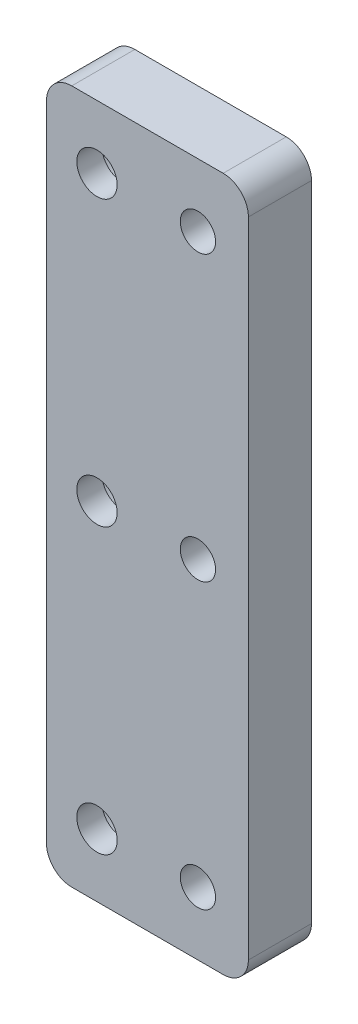
ISO-10303-21;
HEADER;
FILE_DESCRIPTION(('STEP AP214'),'2;1');
FILE_NAME('part.step','',(''),(''),'','','');
FILE_SCHEMA(('AUTOMOTIVE_DESIGN { 1 0 10303 214 1 1 1 1 }'));
ENDSEC;
DATA;
#1=APPLICATION_CONTEXT('core data for automotive mechanical design processes');
#2=APPLICATION_PROTOCOL_DEFINITION('international standard','automotive_design',2000,#1);
#3=PRODUCT_CONTEXT('',#1,'mechanical');
#4=PRODUCT('Part','Part','',(#3));
#5=PRODUCT_RELATED_PRODUCT_CATEGORY('part','',(#4));
#6=PRODUCT_DEFINITION_FORMATION('','',#4);
#7=PRODUCT_DEFINITION_CONTEXT('part definition',#1,'design');
#8=PRODUCT_DEFINITION('design','',#6,#7);
#9=PRODUCT_DEFINITION_SHAPE('','',#8);
#10=(LENGTH_UNIT() NAMED_UNIT(*) SI_UNIT(.MILLI.,.METRE.));
#11=(NAMED_UNIT(*) PLANE_ANGLE_UNIT() SI_UNIT($,.RADIAN.));
#12=(NAMED_UNIT(*) SI_UNIT($,.STERADIAN.) SOLID_ANGLE_UNIT());
#13=UNCERTAINTY_MEASURE_WITH_UNIT(LENGTH_MEASURE(1.E-05),#10,'distance_accuracy_value','');
#14=(GEOMETRIC_REPRESENTATION_CONTEXT(3) GLOBAL_UNCERTAINTY_ASSIGNED_CONTEXT((#13)) GLOBAL_UNIT_ASSIGNED_CONTEXT((#10,
#11,#12)) REPRESENTATION_CONTEXT('',''));
#15=CARTESIAN_POINT('',(0.,0.,0.));
#16=DIRECTION('',(0.,0.,1.));
#17=DIRECTION('',(1.,0.,0.));
#18=AXIS2_PLACEMENT_3D('',#15,#16,#17);
#19=CARTESIAN_POINT('',(-4.,-27.5,-2.5));
#20=DIRECTION('',(0.,-1.,0.));
#21=DIRECTION('',(0.,0.,-1.));
#22=AXIS2_PLACEMENT_3D('',#19,#20,#21);
#23=PLANE('',#22);
#24=DIRECTION('',(1.,0.,0.));
#25=VECTOR('',#24,1.);
#26=CARTESIAN_POINT('',(-4.,-27.5,2.5));
#27=LINE('',#26,#25);
#28=CARTESIAN_POINT('',(-2.,-27.5,2.5));
#29=VERTEX_POINT('',#28);
#30=CARTESIAN_POINT('',(10.,-27.5,2.5));
#31=VERTEX_POINT('',#30);
#32=EDGE_CURVE('E125',#29,#31,#27,.T.);
#33=ORIENTED_EDGE('',*,*,#32,.F.);
#34=DIRECTION('',(0.,0.,1.));
#35=VECTOR('',#34,1.);
#36=CARTESIAN_POINT('',(-2.,-27.5,-2.5));
#37=LINE('',#36,#35);
#38=CARTESIAN_POINT('',(-2.,-27.5,-2.5));
#39=VERTEX_POINT('',#38);
#40=EDGE_CURVE('E145',#29,#39,#37,.F.);
#41=ORIENTED_EDGE('',*,*,#40,.T.);
#42=DIRECTION('',(1.,0.,0.));
#43=VECTOR('',#42,1.);
#44=CARTESIAN_POINT('',(-4.,-27.5,-2.5));
#45=LINE('',#44,#43);
#46=CARTESIAN_POINT('',(10.,-27.5,-2.5));
#47=VERTEX_POINT('',#46);
#48=EDGE_CURVE('E130',#39,#47,#45,.T.);
#49=ORIENTED_EDGE('',*,*,#48,.T.);
#50=DIRECTION('',(0.,0.,1.));
#51=VECTOR('',#50,1.);
#52=CARTESIAN_POINT('',(10.,-27.5,-2.5));
#53=LINE('',#52,#51);
#54=EDGE_CURVE('E142',#47,#31,#53,.T.);
#55=ORIENTED_EDGE('',*,*,#54,.T.);
#56=EDGE_LOOP('',(#33,#41,#49,#55));
#57=FACE_BOUND('',#56,.T.);
#58=ADVANCED_FACE('F37',(#57),#23,.T.);
#59=CARTESIAN_POINT('',(-4.,-27.5,-2.5));
#60=DIRECTION('',(-1.,0.,0.));
#61=DIRECTION('',(0.,0.,1.));
#62=AXIS2_PLACEMENT_3D('',#59,#60,#61);
#63=PLANE('',#62);
#64=DIRECTION('',(0.,-1.,0.));
#65=VECTOR('',#64,1.);
#66=CARTESIAN_POINT('',(-4.,-27.5,-2.5));
#67=LINE('',#66,#65);
#68=CARTESIAN_POINT('',(-4.,25.5,-2.5));
#69=VERTEX_POINT('',#68);
#70=CARTESIAN_POINT('',(-4.,-25.5,-2.5));
#71=VERTEX_POINT('',#70);
#72=EDGE_CURVE('E134',#69,#71,#67,.T.);
#73=ORIENTED_EDGE('',*,*,#72,.T.);
#74=DIRECTION('',(0.,0.,1.));
#75=VECTOR('',#74,1.);
#76=CARTESIAN_POINT('',(-4.,-25.5,-2.5));
#77=LINE('',#76,#75);
#78=CARTESIAN_POINT('',(-4.,-25.5,2.5));
#79=VERTEX_POINT('',#78);
#80=EDGE_CURVE('E124',#71,#79,#77,.T.);
#81=ORIENTED_EDGE('',*,*,#80,.T.);
#82=DIRECTION('',(0.,-1.,0.));
#83=VECTOR('',#82,1.);
#84=CARTESIAN_POINT('',(-4.,-27.5,2.5));
#85=LINE('',#84,#83);
#86=CARTESIAN_POINT('',(-4.,25.5,2.5));
#87=VERTEX_POINT('',#86);
#88=EDGE_CURVE('E108',#87,#79,#85,.T.);
#89=ORIENTED_EDGE('',*,*,#88,.F.);
#90=DIRECTION('',(0.,0.,1.));
#91=VECTOR('',#90,1.);
#92=CARTESIAN_POINT('',(-4.,25.5,-2.5));
#93=LINE('',#92,#91);
#94=EDGE_CURVE('E121',#87,#69,#93,.F.);
#95=ORIENTED_EDGE('',*,*,#94,.T.);
#96=EDGE_LOOP('',(#73,#81,#89,#95));
#97=FACE_BOUND('',#96,.T.);
#98=ADVANCED_FACE('F120',(#97),#63,.T.);
#99=CARTESIAN_POINT('',(-4.,27.5,-2.5));
#100=DIRECTION('',(0.,1.,0.));
#101=DIRECTION('',(0.,0.,1.));
#102=AXIS2_PLACEMENT_3D('',#99,#100,#101);
#103=PLANE('',#102);
#104=DIRECTION('',(-1.,0.,0.));
#105=VECTOR('',#104,1.);
#106=CARTESIAN_POINT('',(-4.,27.5,-2.5));
#107=LINE('',#106,#105);
#108=CARTESIAN_POINT('',(10.,27.5,-2.5));
#109=VERTEX_POINT('',#108);
#110=CARTESIAN_POINT('',(-2.,27.5,-2.5));
#111=VERTEX_POINT('',#110);
#112=EDGE_CURVE('E160',#109,#111,#107,.T.);
#113=ORIENTED_EDGE('',*,*,#112,.T.);
#114=DIRECTION('',(0.,0.,1.));
#115=VECTOR('',#114,1.);
#116=CARTESIAN_POINT('',(-2.,27.5,-2.5));
#117=LINE('',#116,#115);
#118=CARTESIAN_POINT('',(-2.,27.5,2.5));
#119=VERTEX_POINT('',#118);
#120=EDGE_CURVE('E11',#111,#119,#117,.T.);
#121=ORIENTED_EDGE('',*,*,#120,.T.);
#122=DIRECTION('',(-1.,0.,0.));
#123=VECTOR('',#122,1.);
#124=CARTESIAN_POINT('',(-4.,27.5,2.5));
#125=LINE('',#124,#123);
#126=CARTESIAN_POINT('',(10.,27.5,2.5));
#127=VERTEX_POINT('',#126);
#128=EDGE_CURVE('E110',#127,#119,#125,.T.);
#129=ORIENTED_EDGE('',*,*,#128,.F.);
#130=DIRECTION('',(0.,0.,1.));
#131=VECTOR('',#130,1.);
#132=CARTESIAN_POINT('',(10.,27.5,-2.5));
#133=LINE('',#132,#131);
#134=EDGE_CURVE('E45',#127,#109,#133,.F.);
#135=ORIENTED_EDGE('',*,*,#134,.T.);
#136=EDGE_LOOP('',(#113,#121,#129,#135));
#137=FACE_BOUND('',#136,.T.);
#138=ADVANCED_FACE('F159',(#137),#103,.T.);
#139=CARTESIAN_POINT('',(0.,0.,-2.5));
#140=DIRECTION('',(0.,0.,-1.));
#141=DIRECTION('',(-1.,0.,0.));
#142=AXIS2_PLACEMENT_3D('',#139,#140,#141);
#143=PLANE('',#142);
#144=CARTESIAN_POINT('',(0.,22.5,-2.5));
#145=DIRECTION('',(0.,0.,-1.));
#146=DIRECTION('',(-1.,0.,0.));
#147=AXIS2_PLACEMENT_3D('',#144,#145,#146);
#148=CIRCLE('',#147,3.5);
#149=CARTESIAN_POINT('',(-3.5,22.5,-2.5));
#150=VERTEX_POINT('',#149);
#151=EDGE_CURVE('E230',#150,#150,#148,.T.);
#152=ORIENTED_EDGE('',*,*,#151,.F.);
#153=EDGE_LOOP('',(#152));
#154=FACE_BOUND('',#153,.T.);
#155=CARTESIAN_POINT('',(0.,-22.5,-2.5));
#156=DIRECTION('',(0.,0.,-1.));
#157=DIRECTION('',(-1.,0.,0.));
#158=AXIS2_PLACEMENT_3D('',#155,#156,#157);
#159=CIRCLE('',#158,3.5);
#160=CARTESIAN_POINT('',(-3.5,-22.5,-2.5));
#161=VERTEX_POINT('',#160);
#162=EDGE_CURVE('E234',#161,#161,#159,.T.);
#163=ORIENTED_EDGE('',*,*,#162,.F.);
#164=EDGE_LOOP('',(#163));
#165=FACE_BOUND('',#164,.T.);
#166=CARTESIAN_POINT('',(0.,0.,-2.5));
#167=DIRECTION('',(0.,0.,-1.));
#168=DIRECTION('',(-1.,0.,0.));
#169=AXIS2_PLACEMENT_3D('',#166,#167,#168);
#170=CIRCLE('',#169,3.5);
#171=CARTESIAN_POINT('',(-3.5,0.,-2.5));
#172=VERTEX_POINT('',#171);
#173=EDGE_CURVE('E237',#172,#172,#170,.T.);
#174=ORIENTED_EDGE('',*,*,#173,.F.);
#175=EDGE_LOOP('',(#174));
#176=FACE_BOUND('',#175,.T.);
#177=ORIENTED_EDGE('',*,*,#48,.F.);
#178=CARTESIAN_POINT('',(-2.,-25.5,-2.5));
#179=DIRECTION('',(0.,0.,-1.));
#180=DIRECTION('',(-1.,0.,0.));
#181=AXIS2_PLACEMENT_3D('',#178,#179,#180);
#182=CIRCLE('',#181,2.);
#183=EDGE_CURVE('E151',#39,#71,#182,.T.);
#184=ORIENTED_EDGE('',*,*,#183,.T.);
#185=ORIENTED_EDGE('',*,*,#72,.F.);
#186=CARTESIAN_POINT('',(-2.,25.5,-2.5));
#187=DIRECTION('',(0.,0.,-1.));
#188=DIRECTION('',(-1.,0.,0.));
#189=AXIS2_PLACEMENT_3D('',#186,#187,#188);
#190=CIRCLE('',#189,2.);
#191=EDGE_CURVE('E129',#69,#111,#190,.T.);
#192=ORIENTED_EDGE('',*,*,#191,.T.);
#193=ORIENTED_EDGE('',*,*,#112,.F.);
#194=CARTESIAN_POINT('',(10.,25.5,-2.5));
#195=DIRECTION('',(0.,0.,-1.));
#196=DIRECTION('',(-1.,0.,0.));
#197=AXIS2_PLACEMENT_3D('',#194,#195,#196);
#198=CIRCLE('',#197,2.);
#199=CARTESIAN_POINT('',(12.,25.5,-2.5));
#200=VERTEX_POINT('',#199);
#201=EDGE_CURVE('E52',#109,#200,#198,.T.);
#202=ORIENTED_EDGE('',*,*,#201,.T.);
#203=DIRECTION('',(0.,1.,0.));
#204=VECTOR('',#203,1.);
#205=CARTESIAN_POINT('',(12.,27.5,-2.5));
#206=LINE('',#205,#204);
#207=CARTESIAN_POINT('',(12.,-25.5,-2.5));
#208=VERTEX_POINT('',#207);
#209=EDGE_CURVE('E170',#208,#200,#206,.T.);
#210=ORIENTED_EDGE('',*,*,#209,.F.);
#211=CARTESIAN_POINT('',(10.,-25.5,-2.5));
#212=DIRECTION('',(0.,0.,-1.));
#213=DIRECTION('',(-1.,0.,0.));
#214=AXIS2_PLACEMENT_3D('',#211,#212,#213);
#215=CIRCLE('',#214,2.);
#216=EDGE_CURVE('E149',#208,#47,#215,.T.);
#217=ORIENTED_EDGE('',*,*,#216,.T.);
#218=EDGE_LOOP('',(#177,#184,#185,#192,#193,#202,#210,#217));
#219=FACE_BOUND('',#218,.T.);
#220=CARTESIAN_POINT('',(8.00000000000001,-22.5,-2.5));
#221=DIRECTION('',(0.,0.,1.));
#222=DIRECTION('',(1.,0.,0.));
#223=AXIS2_PLACEMENT_3D('',#220,#221,#222);
#224=CIRCLE('',#223,1.4);
#225=CARTESIAN_POINT('',(9.40000000000001,-22.5,-2.5));
#226=VERTEX_POINT('',#225);
#227=EDGE_CURVE('E253',#226,#226,#224,.T.);
#228=ORIENTED_EDGE('',*,*,#227,.T.);
#229=EDGE_LOOP('',(#228));
#230=FACE_BOUND('',#229,.T.);
#231=CARTESIAN_POINT('',(8.,0.,-2.5));
#232=DIRECTION('',(0.,0.,1.));
#233=DIRECTION('',(1.,0.,0.));
#234=AXIS2_PLACEMENT_3D('',#231,#232,#233);
#235=CIRCLE('',#234,1.4);
#236=CARTESIAN_POINT('',(9.4,0.,-2.5));
#237=VERTEX_POINT('',#236);
#238=EDGE_CURVE('E259',#237,#237,#235,.T.);
#239=ORIENTED_EDGE('',*,*,#238,.T.);
#240=EDGE_LOOP('',(#239));
#241=FACE_BOUND('',#240,.T.);
#242=CARTESIAN_POINT('',(8.,22.5,-2.5));
#243=DIRECTION('',(0.,0.,1.));
#244=DIRECTION('',(1.,0.,0.));
#245=AXIS2_PLACEMENT_3D('',#242,#243,#244);
#246=CIRCLE('',#245,1.4);
#247=CARTESIAN_POINT('',(9.4,22.5,-2.5));
#248=VERTEX_POINT('',#247);
#249=EDGE_CURVE('E172',#248,#248,#246,.T.);
#250=ORIENTED_EDGE('',*,*,#249,.T.);
#251=EDGE_LOOP('',(#250));
#252=FACE_BOUND('',#251,.T.);
#253=ADVANCED_FACE('F163',(#154,#165,#176,#219,#230,#241,#252),#143,.T.);
#254=CARTESIAN_POINT('',(0.,0.,2.5));
#255=DIRECTION('',(0.,0.,-1.));
#256=DIRECTION('',(-1.,0.,0.));
#257=AXIS2_PLACEMENT_3D('',#254,#255,#256);
#258=PLANE('',#257);
#259=CARTESIAN_POINT('',(0.,22.5,2.5));
#260=DIRECTION('',(0.,0.,1.));
#261=DIRECTION('',(1.,0.,0.));
#262=AXIS2_PLACEMENT_3D('',#259,#260,#261);
#263=CIRCLE('',#262,1.6);
#264=CARTESIAN_POINT('',(1.6,22.5,2.5));
#265=VERTEX_POINT('',#264);
#266=EDGE_CURVE('E181',#265,#265,#263,.T.);
#267=ORIENTED_EDGE('',*,*,#266,.F.);
#268=EDGE_LOOP('',(#267));
#269=FACE_BOUND('',#268,.T.);
#270=CARTESIAN_POINT('',(0.,-22.5,2.5));
#271=DIRECTION('',(0.,0.,1.));
#272=DIRECTION('',(1.,0.,0.));
#273=AXIS2_PLACEMENT_3D('',#270,#271,#272);
#274=CIRCLE('',#273,1.6);
#275=CARTESIAN_POINT('',(1.6,-22.5,2.5));
#276=VERTEX_POINT('',#275);
#277=EDGE_CURVE('E184',#276,#276,#274,.T.);
#278=ORIENTED_EDGE('',*,*,#277,.F.);
#279=EDGE_LOOP('',(#278));
#280=FACE_BOUND('',#279,.T.);
#281=CARTESIAN_POINT('',(0.,0.,2.5));
#282=DIRECTION('',(0.,0.,1.));
#283=DIRECTION('',(1.,0.,0.));
#284=AXIS2_PLACEMENT_3D('',#281,#282,#283);
#285=CIRCLE('',#284,1.6);
#286=CARTESIAN_POINT('',(1.6,0.,2.5));
#287=VERTEX_POINT('',#286);
#288=EDGE_CURVE('E174',#287,#287,#285,.T.);
#289=ORIENTED_EDGE('',*,*,#288,.F.);
#290=EDGE_LOOP('',(#289));
#291=FACE_BOUND('',#290,.T.);
#292=ORIENTED_EDGE('',*,*,#88,.T.);
#293=CARTESIAN_POINT('',(-2.,-25.5,2.5));
#294=DIRECTION('',(0.,0.,-1.));
#295=DIRECTION('',(-1.,0.,0.));
#296=AXIS2_PLACEMENT_3D('',#293,#294,#295);
#297=CIRCLE('',#296,2.);
#298=EDGE_CURVE('E140',#79,#29,#297,.F.);
#299=ORIENTED_EDGE('',*,*,#298,.T.);
#300=ORIENTED_EDGE('',*,*,#32,.T.);
#301=CARTESIAN_POINT('',(10.,-25.5,2.5));
#302=DIRECTION('',(0.,0.,-1.));
#303=DIRECTION('',(-1.,0.,0.));
#304=AXIS2_PLACEMENT_3D('',#301,#302,#303);
#305=CIRCLE('',#304,2.);
#306=CARTESIAN_POINT('',(12.,-25.5,2.5));
#307=VERTEX_POINT('',#306);
#308=EDGE_CURVE('E114',#31,#307,#305,.F.);
#309=ORIENTED_EDGE('',*,*,#308,.T.);
#310=DIRECTION('',(0.,1.,0.));
#311=VECTOR('',#310,1.);
#312=CARTESIAN_POINT('',(12.,27.5,2.5));
#313=LINE('',#312,#311);
#314=CARTESIAN_POINT('',(12.,25.5,2.5));
#315=VERTEX_POINT('',#314);
#316=EDGE_CURVE('E169',#307,#315,#313,.T.);
#317=ORIENTED_EDGE('',*,*,#316,.T.);
#318=CARTESIAN_POINT('',(10.,25.5,2.5));
#319=DIRECTION('',(0.,0.,-1.));
#320=DIRECTION('',(-1.,0.,0.));
#321=AXIS2_PLACEMENT_3D('',#318,#319,#320);
#322=CIRCLE('',#321,2.);
#323=EDGE_CURVE('E115',#315,#127,#322,.F.);
#324=ORIENTED_EDGE('',*,*,#323,.T.);
#325=ORIENTED_EDGE('',*,*,#128,.T.);
#326=CARTESIAN_POINT('',(-2.,25.5,2.5));
#327=DIRECTION('',(0.,0.,-1.));
#328=DIRECTION('',(-1.,0.,0.));
#329=AXIS2_PLACEMENT_3D('',#326,#327,#328);
#330=CIRCLE('',#329,2.);
#331=EDGE_CURVE('E104',#119,#87,#330,.F.);
#332=ORIENTED_EDGE('',*,*,#331,.T.);
#333=EDGE_LOOP('',(#292,#299,#300,#309,#317,#324,#325,#332));
#334=FACE_BOUND('',#333,.T.);
#335=CARTESIAN_POINT('',(8.00000000000001,-22.5,2.5));
#336=DIRECTION('',(0.,0.,1.));
#337=DIRECTION('',(1.,0.,0.));
#338=AXIS2_PLACEMENT_3D('',#335,#336,#337);
#339=CIRCLE('',#338,1.4);
#340=CARTESIAN_POINT('',(9.40000000000001,-22.5,2.5));
#341=VERTEX_POINT('',#340);
#342=EDGE_CURVE('E252',#341,#341,#339,.T.);
#343=ORIENTED_EDGE('',*,*,#342,.F.);
#344=EDGE_LOOP('',(#343));
#345=FACE_BOUND('',#344,.T.);
#346=CARTESIAN_POINT('',(8.,0.,2.5));
#347=DIRECTION('',(0.,0.,1.));
#348=DIRECTION('',(1.,0.,0.));
#349=AXIS2_PLACEMENT_3D('',#346,#347,#348);
#350=CIRCLE('',#349,1.4);
#351=CARTESIAN_POINT('',(9.4,0.,2.5));
#352=VERTEX_POINT('',#351);
#353=EDGE_CURVE('E256',#352,#352,#350,.T.);
#354=ORIENTED_EDGE('',*,*,#353,.F.);
#355=EDGE_LOOP('',(#354));
#356=FACE_BOUND('',#355,.T.);
#357=CARTESIAN_POINT('',(8.,22.5,2.5));
#358=DIRECTION('',(0.,0.,1.));
#359=DIRECTION('',(1.,0.,0.));
#360=AXIS2_PLACEMENT_3D('',#357,#358,#359);
#361=CIRCLE('',#360,1.4);
#362=CARTESIAN_POINT('',(9.4,22.5,2.5));
#363=VERTEX_POINT('',#362);
#364=EDGE_CURVE('E177',#363,#363,#361,.T.);
#365=ORIENTED_EDGE('',*,*,#364,.F.);
#366=EDGE_LOOP('',(#365));
#367=FACE_BOUND('',#366,.T.);
#368=ADVANCED_FACE('F106',(#269,#280,#291,#334,#345,#356,#367),#258,.F.);
#369=CARTESIAN_POINT('',(0.,0.,-2.5));
#370=DIRECTION('',(0.,0.,1.));
#371=DIRECTION('',(1.,0.,0.));
#372=AXIS2_PLACEMENT_3D('',#369,#370,#371);
#373=CYLINDRICAL_SURFACE('',#372,1.6);
#374=CARTESIAN_POINT('',(0.,0.,0.499999999999999));
#375=DIRECTION('',(0.,0.,-1.));
#376=DIRECTION('',(-1.,0.,0.));
#377=AXIS2_PLACEMENT_3D('',#374,#375,#376);
#378=CIRCLE('',#377,1.6);
#379=CARTESIAN_POINT('',(-1.6,0.,0.499999999999999));
#380=VERTEX_POINT('',#379);
#381=EDGE_CURVE('E243',#380,#380,#378,.T.);
#382=ORIENTED_EDGE('',*,*,#381,.T.);
#383=EDGE_LOOP('',(#382));
#384=FACE_BOUND('',#383,.T.);
#385=ORIENTED_EDGE('',*,*,#288,.T.);
#386=EDGE_LOOP('',(#385));
#387=FACE_BOUND('',#386,.T.);
#388=ADVANCED_FACE('F225',(#384,#387),#373,.F.);
#389=CARTESIAN_POINT('',(0.,-22.5,-2.5));
#390=DIRECTION('',(0.,0.,1.));
#391=DIRECTION('',(1.,0.,0.));
#392=AXIS2_PLACEMENT_3D('',#389,#390,#391);
#393=CYLINDRICAL_SURFACE('',#392,1.6);
#394=CARTESIAN_POINT('',(0.,-22.5,0.499999999999999));
#395=DIRECTION('',(0.,0.,-1.));
#396=DIRECTION('',(-1.,0.,0.));
#397=AXIS2_PLACEMENT_3D('',#394,#395,#396);
#398=CIRCLE('',#397,1.6);
#399=CARTESIAN_POINT('',(-1.6,-22.5,0.499999999999999));
#400=VERTEX_POINT('',#399);
#401=EDGE_CURVE('E240',#400,#400,#398,.T.);
#402=ORIENTED_EDGE('',*,*,#401,.T.);
#403=EDGE_LOOP('',(#402));
#404=FACE_BOUND('',#403,.T.);
#405=ORIENTED_EDGE('',*,*,#277,.T.);
#406=EDGE_LOOP('',(#405));
#407=FACE_BOUND('',#406,.T.);
#408=ADVANCED_FACE('F286',(#404,#407),#393,.F.);
#409=CARTESIAN_POINT('',(0.,22.5,-2.5));
#410=DIRECTION('',(0.,0.,1.));
#411=DIRECTION('',(1.,0.,0.));
#412=AXIS2_PLACEMENT_3D('',#409,#410,#411);
#413=CYLINDRICAL_SURFACE('',#412,1.6);
#414=CARTESIAN_POINT('',(0.,22.5,0.499999999999999));
#415=DIRECTION('',(0.,0.,-1.));
#416=DIRECTION('',(-1.,0.,0.));
#417=AXIS2_PLACEMENT_3D('',#414,#415,#416);
#418=CIRCLE('',#417,1.6);
#419=CARTESIAN_POINT('',(-1.6,22.5,0.499999999999999));
#420=VERTEX_POINT('',#419);
#421=EDGE_CURVE('E517',#420,#420,#418,.T.);
#422=ORIENTED_EDGE('',*,*,#421,.T.);
#423=EDGE_LOOP('',(#422));
#424=FACE_BOUND('',#423,.T.);
#425=ORIENTED_EDGE('',*,*,#266,.T.);
#426=EDGE_LOOP('',(#425));
#427=FACE_BOUND('',#426,.T.);
#428=ADVANCED_FACE('F279',(#424,#427),#413,.F.);
#429=CARTESIAN_POINT('',(12.,27.5,-2.5));
#430=DIRECTION('',(1.,0.,0.));
#431=DIRECTION('',(0.,1.,0.));
#432=AXIS2_PLACEMENT_3D('',#429,#430,#431);
#433=PLANE('',#432);
#434=ORIENTED_EDGE('',*,*,#316,.F.);
#435=DIRECTION('',(0.,0.,1.));
#436=VECTOR('',#435,1.);
#437=CARTESIAN_POINT('',(12.,-25.5,-2.5));
#438=LINE('',#437,#436);
#439=EDGE_CURVE('E59',#307,#208,#438,.F.);
#440=ORIENTED_EDGE('',*,*,#439,.T.);
#441=ORIENTED_EDGE('',*,*,#209,.T.);
#442=DIRECTION('',(0.,0.,1.));
#443=VECTOR('',#442,1.);
#444=CARTESIAN_POINT('',(12.,25.5,-2.5));
#445=LINE('',#444,#443);
#446=EDGE_CURVE('E153',#200,#315,#445,.T.);
#447=ORIENTED_EDGE('',*,*,#446,.T.);
#448=EDGE_LOOP('',(#434,#440,#441,#447));
#449=FACE_BOUND('',#448,.T.);
#450=ADVANCED_FACE('F168',(#449),#433,.T.);
#451=CARTESIAN_POINT('',(8.,22.5,-2.5));
#452=DIRECTION('',(0.,0.,1.));
#453=DIRECTION('',(1.,0.,0.));
#454=AXIS2_PLACEMENT_3D('',#451,#452,#453);
#455=CYLINDRICAL_SURFACE('',#454,1.4);
#456=ORIENTED_EDGE('',*,*,#249,.F.);
#457=EDGE_LOOP('',(#456));
#458=FACE_BOUND('',#457,.T.);
#459=ORIENTED_EDGE('',*,*,#364,.T.);
#460=EDGE_LOOP('',(#459));
#461=FACE_BOUND('',#460,.T.);
#462=ADVANCED_FACE('F266',(#458,#461),#455,.F.);
#463=CARTESIAN_POINT('',(8.,0.,-2.5));
#464=DIRECTION('',(0.,0.,1.));
#465=DIRECTION('',(1.,0.,0.));
#466=AXIS2_PLACEMENT_3D('',#463,#464,#465);
#467=CYLINDRICAL_SURFACE('',#466,1.4);
#468=ORIENTED_EDGE('',*,*,#238,.F.);
#469=EDGE_LOOP('',(#468));
#470=FACE_BOUND('',#469,.T.);
#471=ORIENTED_EDGE('',*,*,#353,.T.);
#472=EDGE_LOOP('',(#471));
#473=FACE_BOUND('',#472,.T.);
#474=ADVANCED_FACE('F269',(#470,#473),#467,.F.);
#475=CARTESIAN_POINT('',(8.00000000000001,-22.5,-2.5));
#476=DIRECTION('',(0.,0.,1.));
#477=DIRECTION('',(1.,0.,0.));
#478=AXIS2_PLACEMENT_3D('',#475,#476,#477);
#479=CYLINDRICAL_SURFACE('',#478,1.4);
#480=ORIENTED_EDGE('',*,*,#227,.F.);
#481=EDGE_LOOP('',(#480));
#482=FACE_BOUND('',#481,.T.);
#483=ORIENTED_EDGE('',*,*,#342,.T.);
#484=EDGE_LOOP('',(#483));
#485=FACE_BOUND('',#484,.T.);
#486=ADVANCED_FACE('F276',(#482,#485),#479,.F.);
#487=CARTESIAN_POINT('',(1.6,0.,0.499999999999999));
#488=DIRECTION('',(0.,0.,1.));
#489=DIRECTION('',(1.,0.,0.));
#490=AXIS2_PLACEMENT_3D('',#487,#488,#489);
#491=PLANE('',#490);
#492=ORIENTED_EDGE('',*,*,#381,.F.);
#493=EDGE_LOOP('',(#492));
#494=FACE_BOUND('',#493,.T.);
#495=CARTESIAN_POINT('',(0.,0.,0.499999999999999));
#496=DIRECTION('',(0.,0.,-1.));
#497=DIRECTION('',(-1.,0.,0.));
#498=AXIS2_PLACEMENT_3D('',#495,#496,#497);
#499=CIRCLE('',#498,3.5);
#500=CARTESIAN_POINT('',(-3.5,0.,0.499999999999999));
#501=VERTEX_POINT('',#500);
#502=EDGE_CURVE('E239',#501,#501,#499,.T.);
#503=ORIENTED_EDGE('',*,*,#502,.T.);
#504=EDGE_LOOP('',(#503));
#505=FACE_BOUND('',#504,.T.);
#506=ADVANCED_FACE('F300',(#494,#505),#491,.F.);
#507=CARTESIAN_POINT('',(0.,0.,-2.5));
#508=DIRECTION('',(0.,0.,-1.));
#509=DIRECTION('',(-1.,0.,0.));
#510=AXIS2_PLACEMENT_3D('',#507,#508,#509);
#511=CYLINDRICAL_SURFACE('',#510,3.5);
#512=ORIENTED_EDGE('',*,*,#502,.F.);
#513=EDGE_LOOP('',(#512));
#514=FACE_BOUND('',#513,.T.);
#515=ORIENTED_EDGE('',*,*,#173,.T.);
#516=EDGE_LOOP('',(#515));
#517=FACE_BOUND('',#516,.T.);
#518=ADVANCED_FACE('F303',(#514,#517),#511,.F.);
#519=CARTESIAN_POINT('',(1.6,-22.5,0.499999999999999));
#520=DIRECTION('',(0.,0.,1.));
#521=DIRECTION('',(1.,0.,0.));
#522=AXIS2_PLACEMENT_3D('',#519,#520,#521);
#523=PLANE('',#522);
#524=ORIENTED_EDGE('',*,*,#401,.F.);
#525=EDGE_LOOP('',(#524));
#526=FACE_BOUND('',#525,.T.);
#527=CARTESIAN_POINT('',(0.,-22.5,0.499999999999999));
#528=DIRECTION('',(0.,0.,-1.));
#529=DIRECTION('',(-1.,0.,0.));
#530=AXIS2_PLACEMENT_3D('',#527,#528,#529);
#531=CIRCLE('',#530,3.5);
#532=CARTESIAN_POINT('',(-3.5,-22.5,0.499999999999999));
#533=VERTEX_POINT('',#532);
#534=EDGE_CURVE('E246',#533,#533,#531,.T.);
#535=ORIENTED_EDGE('',*,*,#534,.T.);
#536=EDGE_LOOP('',(#535));
#537=FACE_BOUND('',#536,.T.);
#538=ADVANCED_FACE('F308',(#526,#537),#523,.F.);
#539=CARTESIAN_POINT('',(0.,-22.5,-2.5));
#540=DIRECTION('',(0.,0.,-1.));
#541=DIRECTION('',(-1.,0.,0.));
#542=AXIS2_PLACEMENT_3D('',#539,#540,#541);
#543=CYLINDRICAL_SURFACE('',#542,3.5);
#544=ORIENTED_EDGE('',*,*,#534,.F.);
#545=EDGE_LOOP('',(#544));
#546=FACE_BOUND('',#545,.T.);
#547=ORIENTED_EDGE('',*,*,#162,.T.);
#548=EDGE_LOOP('',(#547));
#549=FACE_BOUND('',#548,.T.);
#550=ADVANCED_FACE('F313',(#546,#549),#543,.F.);
#551=CARTESIAN_POINT('',(1.6,22.5,0.499999999999999));
#552=DIRECTION('',(0.,0.,1.));
#553=DIRECTION('',(1.,0.,0.));
#554=AXIS2_PLACEMENT_3D('',#551,#552,#553);
#555=PLANE('',#554);
#556=ORIENTED_EDGE('',*,*,#421,.F.);
#557=EDGE_LOOP('',(#556));
#558=FACE_BOUND('',#557,.T.);
#559=CARTESIAN_POINT('',(0.,22.5,0.499999999999999));
#560=DIRECTION('',(0.,0.,-1.));
#561=DIRECTION('',(-1.,0.,0.));
#562=AXIS2_PLACEMENT_3D('',#559,#560,#561);
#563=CIRCLE('',#562,3.5);
#564=CARTESIAN_POINT('',(-3.5,22.5,0.499999999999999));
#565=VERTEX_POINT('',#564);
#566=EDGE_CURVE('E515',#565,#565,#563,.T.);
#567=ORIENTED_EDGE('',*,*,#566,.T.);
#568=EDGE_LOOP('',(#567));
#569=FACE_BOUND('',#568,.T.);
#570=ADVANCED_FACE('F362',(#558,#569),#555,.F.);
#571=CARTESIAN_POINT('',(0.,22.5,-2.5));
#572=DIRECTION('',(0.,0.,-1.));
#573=DIRECTION('',(-1.,0.,0.));
#574=AXIS2_PLACEMENT_3D('',#571,#572,#573);
#575=CYLINDRICAL_SURFACE('',#574,3.5);
#576=ORIENTED_EDGE('',*,*,#566,.F.);
#577=EDGE_LOOP('',(#576));
#578=FACE_BOUND('',#577,.T.);
#579=ORIENTED_EDGE('',*,*,#151,.T.);
#580=EDGE_LOOP('',(#579));
#581=FACE_BOUND('',#580,.T.);
#582=ADVANCED_FACE('F206',(#578,#581),#575,.F.);
#583=CARTESIAN_POINT('',(-2.,-25.5,-2.5));
#584=DIRECTION('',(0.,0.,1.));
#585=DIRECTION('',(1.,0.,0.));
#586=AXIS2_PLACEMENT_3D('',#583,#584,#585);
#587=CYLINDRICAL_SURFACE('',#586,2.);
#588=ORIENTED_EDGE('',*,*,#183,.F.);
#589=ORIENTED_EDGE('',*,*,#40,.F.);
#590=ORIENTED_EDGE('',*,*,#298,.F.);
#591=ORIENTED_EDGE('',*,*,#80,.F.);
#592=EDGE_LOOP('',(#588,#589,#590,#591));
#593=FACE_BOUND('',#592,.T.);
#594=ADVANCED_FACE('F192',(#593),#587,.T.);
#595=CARTESIAN_POINT('',(10.,-25.5,-2.5));
#596=DIRECTION('',(0.,0.,1.));
#597=DIRECTION('',(1.,0.,0.));
#598=AXIS2_PLACEMENT_3D('',#595,#596,#597);
#599=CYLINDRICAL_SURFACE('',#598,2.);
#600=ORIENTED_EDGE('',*,*,#216,.F.);
#601=ORIENTED_EDGE('',*,*,#439,.F.);
#602=ORIENTED_EDGE('',*,*,#308,.F.);
#603=ORIENTED_EDGE('',*,*,#54,.F.);
#604=EDGE_LOOP('',(#600,#601,#602,#603));
#605=FACE_BOUND('',#604,.T.);
#606=ADVANCED_FACE('F199',(#605),#599,.T.);
#607=CARTESIAN_POINT('',(-2.,25.5,-2.5));
#608=DIRECTION('',(0.,0.,1.));
#609=DIRECTION('',(1.,0.,0.));
#610=AXIS2_PLACEMENT_3D('',#607,#608,#609);
#611=CYLINDRICAL_SURFACE('',#610,2.);
#612=ORIENTED_EDGE('',*,*,#191,.F.);
#613=ORIENTED_EDGE('',*,*,#94,.F.);
#614=ORIENTED_EDGE('',*,*,#331,.F.);
#615=ORIENTED_EDGE('',*,*,#120,.F.);
#616=EDGE_LOOP('',(#612,#613,#614,#615));
#617=FACE_BOUND('',#616,.T.);
#618=ADVANCED_FACE('F128',(#617),#611,.T.);
#619=CARTESIAN_POINT('',(10.,25.5,-2.5));
#620=DIRECTION('',(0.,0.,1.));
#621=DIRECTION('',(1.,0.,0.));
#622=AXIS2_PLACEMENT_3D('',#619,#620,#621);
#623=CYLINDRICAL_SURFACE('',#622,2.);
#624=ORIENTED_EDGE('',*,*,#201,.F.);
#625=ORIENTED_EDGE('',*,*,#134,.F.);
#626=ORIENTED_EDGE('',*,*,#323,.F.);
#627=ORIENTED_EDGE('',*,*,#446,.F.);
#628=EDGE_LOOP('',(#624,#625,#626,#627));
#629=FACE_BOUND('',#628,.T.);
#630=ADVANCED_FACE('F39',(#629),#623,.T.);
#631=CLOSED_SHELL('',(#58,#98,#138,#253,#368,#388,#408,#428,#450,#462,#474,#486,#506,#518,#538,
#550,#570,#582,#594,#606,#618,#630));
#632=MANIFOLD_SOLID_BREP('B2',#631);
#633=ADVANCED_BREP_SHAPE_REPRESENTATION('',(#18,#632),#14);
#634=SHAPE_DEFINITION_REPRESENTATION(#9,#633);
ENDSEC;
END-ISO-10303-21;
